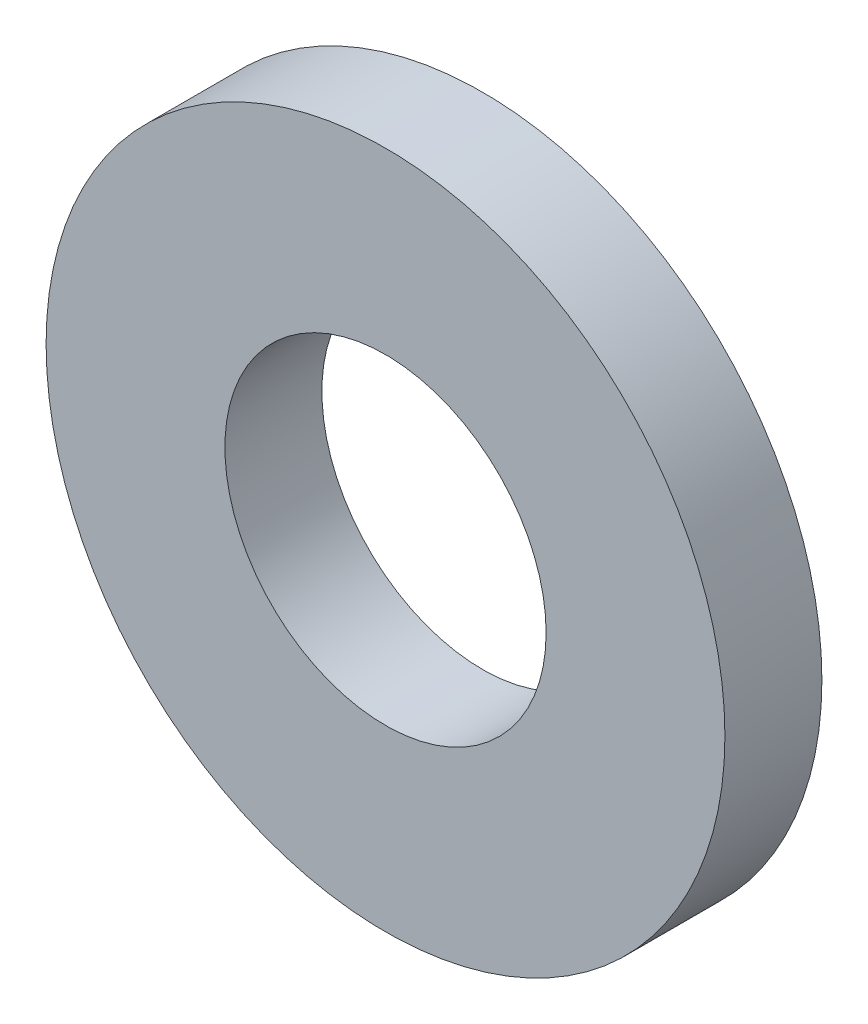
ISO-10303-21;
HEADER;
FILE_DESCRIPTION(('STEP AP214'),'2;1');
FILE_NAME('part.step','',(''),(''),'','','');
FILE_SCHEMA(('AUTOMOTIVE_DESIGN { 1 0 10303 214 1 1 1 1 }'));
ENDSEC;
DATA;
#1=APPLICATION_CONTEXT('core data for automotive mechanical design processes');
#2=APPLICATION_PROTOCOL_DEFINITION('international standard','automotive_design',2000,#1);
#3=PRODUCT_CONTEXT('',#1,'mechanical');
#4=PRODUCT('Part','Part','',(#3));
#5=PRODUCT_RELATED_PRODUCT_CATEGORY('part','',(#4));
#6=PRODUCT_DEFINITION_FORMATION('','',#4);
#7=PRODUCT_DEFINITION_CONTEXT('part definition',#1,'design');
#8=PRODUCT_DEFINITION('design','',#6,#7);
#9=PRODUCT_DEFINITION_SHAPE('','',#8);
#10=(LENGTH_UNIT() NAMED_UNIT(*) SI_UNIT(.MILLI.,.METRE.));
#11=(NAMED_UNIT(*) PLANE_ANGLE_UNIT() SI_UNIT($,.RADIAN.));
#12=(NAMED_UNIT(*) SI_UNIT($,.STERADIAN.) SOLID_ANGLE_UNIT());
#13=UNCERTAINTY_MEASURE_WITH_UNIT(LENGTH_MEASURE(1.E-05),#10,'distance_accuracy_value','');
#14=(GEOMETRIC_REPRESENTATION_CONTEXT(3) GLOBAL_UNCERTAINTY_ASSIGNED_CONTEXT((#13)) GLOBAL_UNIT_ASSIGNED_CONTEXT((#10,
#11,#12)) REPRESENTATION_CONTEXT('',''));
#15=CARTESIAN_POINT('',(0.,0.,0.));
#16=DIRECTION('',(0.,0.,1.));
#17=DIRECTION('',(1.,0.,0.));
#18=AXIS2_PLACEMENT_3D('',#15,#16,#17);
#19=CARTESIAN_POINT('',(0.,0.,0.8));
#20=DIRECTION('',(0.,0.,1.));
#21=DIRECTION('',(1.,0.,0.));
#22=AXIS2_PLACEMENT_3D('',#19,#20,#21);
#23=PLANE('',#22);
#24=CARTESIAN_POINT('',(0.,0.,0.8));
#25=DIRECTION('',(0.,0.,1.));
#26=DIRECTION('',(1.,0.,0.));
#27=AXIS2_PLACEMENT_3D('',#24,#25,#26);
#28=CIRCLE('',#27,2.8);
#29=CARTESIAN_POINT('',(2.8,0.,0.8));
#30=VERTEX_POINT('',#29);
#31=EDGE_CURVE('E12',#30,#30,#28,.T.);
#32=ORIENTED_EDGE('',*,*,#31,.T.);
#33=EDGE_LOOP('',(#32));
#34=FACE_BOUND('',#33,.T.);
#35=CARTESIAN_POINT('',(0.,0.,0.8));
#36=DIRECTION('',(0.,0.,1.));
#37=DIRECTION('',(1.,0.,0.));
#38=AXIS2_PLACEMENT_3D('',#35,#36,#37);
#39=CIRCLE('',#38,1.325);
#40=CARTESIAN_POINT('',(1.325,0.,0.8));
#41=VERTEX_POINT('',#40);
#42=EDGE_CURVE('E54',#41,#41,#39,.T.);
#43=ORIENTED_EDGE('',*,*,#42,.F.);
#44=EDGE_LOOP('',(#43));
#45=FACE_BOUND('',#44,.T.);
#46=ADVANCED_FACE('F43',(#34,#45),#23,.T.);
#47=CARTESIAN_POINT('',(0.,0.,0.));
#48=DIRECTION('',(0.,0.,1.));
#49=DIRECTION('',(1.,0.,0.));
#50=AXIS2_PLACEMENT_3D('',#47,#48,#49);
#51=PLANE('',#50);
#52=CARTESIAN_POINT('',(0.,0.,0.));
#53=DIRECTION('',(0.,0.,1.));
#54=DIRECTION('',(1.,0.,0.));
#55=AXIS2_PLACEMENT_3D('',#52,#53,#54);
#56=CIRCLE('',#55,2.8);
#57=CARTESIAN_POINT('',(2.8,0.,0.));
#58=VERTEX_POINT('',#57);
#59=EDGE_CURVE('E47',#58,#58,#56,.T.);
#60=ORIENTED_EDGE('',*,*,#59,.F.);
#61=EDGE_LOOP('',(#60));
#62=FACE_BOUND('',#61,.T.);
#63=CARTESIAN_POINT('',(0.,0.,0.));
#64=DIRECTION('',(0.,0.,1.));
#65=DIRECTION('',(1.,0.,0.));
#66=AXIS2_PLACEMENT_3D('',#63,#64,#65);
#67=CIRCLE('',#66,1.325);
#68=CARTESIAN_POINT('',(1.325,0.,0.));
#69=VERTEX_POINT('',#68);
#70=EDGE_CURVE('E56',#69,#69,#67,.T.);
#71=ORIENTED_EDGE('',*,*,#70,.T.);
#72=EDGE_LOOP('',(#71));
#73=FACE_BOUND('',#72,.T.);
#74=ADVANCED_FACE('F66',(#62,#73),#51,.F.);
#75=CARTESIAN_POINT('',(0.,0.,0.8));
#76=DIRECTION('',(0.,0.,-1.));
#77=DIRECTION('',(-1.,0.,0.));
#78=AXIS2_PLACEMENT_3D('',#75,#76,#77);
#79=CYLINDRICAL_SURFACE('',#78,2.8);
#80=ORIENTED_EDGE('',*,*,#31,.F.);
#81=EDGE_LOOP('',(#80));
#82=FACE_BOUND('',#81,.T.);
#83=ORIENTED_EDGE('',*,*,#59,.T.);
#84=EDGE_LOOP('',(#83));
#85=FACE_BOUND('',#84,.T.);
#86=ADVANCED_FACE('F45',(#82,#85),#79,.T.);
#87=CARTESIAN_POINT('',(0.,0.,0.8));
#88=DIRECTION('',(0.,0.,-1.));
#89=DIRECTION('',(-1.,0.,0.));
#90=AXIS2_PLACEMENT_3D('',#87,#88,#89);
#91=CYLINDRICAL_SURFACE('',#90,1.325);
#92=ORIENTED_EDGE('',*,*,#42,.T.);
#93=EDGE_LOOP('',(#92));
#94=FACE_BOUND('',#93,.T.);
#95=ORIENTED_EDGE('',*,*,#70,.F.);
#96=EDGE_LOOP('',(#95));
#97=FACE_BOUND('',#96,.T.);
#98=ADVANCED_FACE('F62',(#94,#97),#91,.F.);
#99=CLOSED_SHELL('',(#46,#74,#86,#98));
#100=MANIFOLD_SOLID_BREP('B2',#99);
#101=ADVANCED_BREP_SHAPE_REPRESENTATION('',(#18,#100),#14);
#102=SHAPE_DEFINITION_REPRESENTATION(#9,#101);
ENDSEC;
END-ISO-10303-21;
